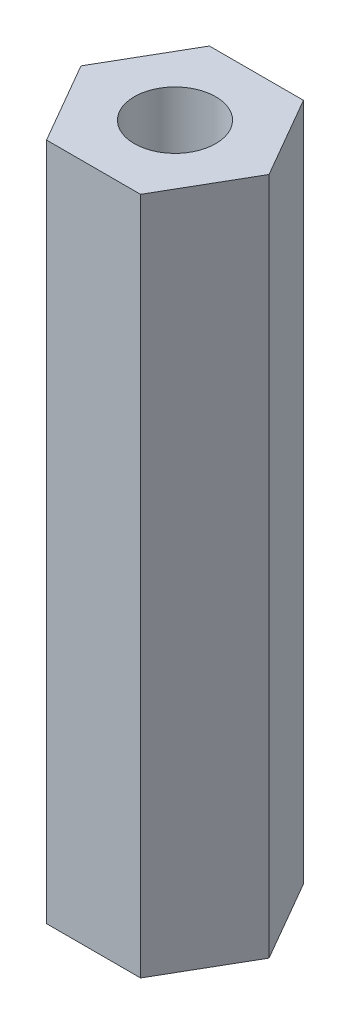
ISO-10303-21;
HEADER;
FILE_DESCRIPTION(('STEP AP214'),'2;1');
FILE_NAME('part.step','',(''),(''),'','','');
FILE_SCHEMA(('AUTOMOTIVE_DESIGN { 1 0 10303 214 1 1 1 1 }'));
ENDSEC;
DATA;
#1=APPLICATION_CONTEXT('core data for automotive mechanical design processes');
#2=APPLICATION_PROTOCOL_DEFINITION('international standard','automotive_design',2000,#1);
#3=PRODUCT_CONTEXT('',#1,'mechanical');
#4=PRODUCT('Part','Part','',(#3));
#5=PRODUCT_RELATED_PRODUCT_CATEGORY('part','',(#4));
#6=PRODUCT_DEFINITION_FORMATION('','',#4);
#7=PRODUCT_DEFINITION_CONTEXT('part definition',#1,'design');
#8=PRODUCT_DEFINITION('design','',#6,#7);
#9=PRODUCT_DEFINITION_SHAPE('','',#8);
#10=(LENGTH_UNIT() NAMED_UNIT(*) SI_UNIT(.MILLI.,.METRE.));
#11=(NAMED_UNIT(*) PLANE_ANGLE_UNIT() SI_UNIT($,.RADIAN.));
#12=(NAMED_UNIT(*) SI_UNIT($,.STERADIAN.) SOLID_ANGLE_UNIT());
#13=UNCERTAINTY_MEASURE_WITH_UNIT(LENGTH_MEASURE(1.E-05),#10,'distance_accuracy_value','');
#14=(GEOMETRIC_REPRESENTATION_CONTEXT(3) GLOBAL_UNCERTAINTY_ASSIGNED_CONTEXT((#13)) GLOBAL_UNIT_ASSIGNED_CONTEXT((#10,
#11,#12)) REPRESENTATION_CONTEXT('',''));
#15=CARTESIAN_POINT('',(0.,0.,0.));
#16=DIRECTION('',(0.,0.,1.));
#17=DIRECTION('',(1.,0.,0.));
#18=AXIS2_PLACEMENT_3D('',#15,#16,#17);
#19=CARTESIAN_POINT('',(0.,25.,0.));
#20=DIRECTION('',(0.,1.,0.));
#21=DIRECTION('',(0.,0.,1.));
#22=AXIS2_PLACEMENT_3D('',#19,#20,#21);
#23=PLANE('',#22);
#24=DIRECTION('',(-1.,0.,0.));
#25=VECTOR('',#24,1.);
#26=CARTESIAN_POINT('',(1.73205080756888,25.,-3.));
#27=LINE('',#26,#25);
#28=CARTESIAN_POINT('',(1.73205080756888,25.,-3.));
#29=VERTEX_POINT('',#28);
#30=CARTESIAN_POINT('',(-1.73205080756888,25.,-3.));
#31=VERTEX_POINT('',#30);
#32=EDGE_CURVE('E128',#29,#31,#27,.T.);
#33=ORIENTED_EDGE('',*,*,#32,.T.);
#34=DIRECTION('',(-0.5,0.,0.866025403784439));
#35=VECTOR('',#34,1.);
#36=CARTESIAN_POINT('',(-1.73205080756888,25.,-3.));
#37=LINE('',#36,#35);
#38=CARTESIAN_POINT('',(-3.46410161513775,25.,0.));
#39=VERTEX_POINT('',#38);
#40=EDGE_CURVE('E86',#31,#39,#37,.T.);
#41=ORIENTED_EDGE('',*,*,#40,.T.);
#42=DIRECTION('',(0.5,0.,0.866025403784439));
#43=VECTOR('',#42,1.);
#44=CARTESIAN_POINT('',(-3.46410161513775,25.,0.));
#45=LINE('',#44,#43);
#46=CARTESIAN_POINT('',(-1.73205080756888,25.,3.));
#47=VERTEX_POINT('',#46);
#48=EDGE_CURVE('E99',#39,#47,#45,.T.);
#49=ORIENTED_EDGE('',*,*,#48,.T.);
#50=DIRECTION('',(1.,0.,0.));
#51=VECTOR('',#50,1.);
#52=CARTESIAN_POINT('',(-1.73205080756888,25.,3.));
#53=LINE('',#52,#51);
#54=CARTESIAN_POINT('',(1.73205080756888,25.,3.));
#55=VERTEX_POINT('',#54);
#56=EDGE_CURVE('E93',#47,#55,#53,.T.);
#57=ORIENTED_EDGE('',*,*,#56,.T.);
#58=DIRECTION('',(0.5,0.,-0.866025403784438));
#59=VECTOR('',#58,1.);
#60=CARTESIAN_POINT('',(1.73205080756888,25.,3.));
#61=LINE('',#60,#59);
#62=CARTESIAN_POINT('',(3.46410161513776,25.,0.));
#63=VERTEX_POINT('',#62);
#64=EDGE_CURVE('E97',#55,#63,#61,.T.);
#65=ORIENTED_EDGE('',*,*,#64,.T.);
#66=DIRECTION('',(-0.5,0.,-0.866025403784439));
#67=VECTOR('',#66,1.);
#68=CARTESIAN_POINT('',(3.46410161513776,25.,0.));
#69=LINE('',#68,#67);
#70=EDGE_CURVE('E49',#63,#29,#69,.T.);
#71=ORIENTED_EDGE('',*,*,#70,.T.);
#72=EDGE_LOOP('',(#33,#41,#49,#57,#65,#71));
#73=FACE_BOUND('',#72,.T.);
#74=CARTESIAN_POINT('',(0.,25.,0.));
#75=DIRECTION('',(0.,1.,0.));
#76=DIRECTION('',(0.,0.,1.));
#77=AXIS2_PLACEMENT_3D('',#74,#75,#76);
#78=CIRCLE('',#77,1.5);
#79=CARTESIAN_POINT('',(0.,25.,1.5));
#80=VERTEX_POINT('',#79);
#81=EDGE_CURVE('E121',#80,#80,#78,.T.);
#82=ORIENTED_EDGE('',*,*,#81,.F.);
#83=EDGE_LOOP('',(#82));
#84=FACE_BOUND('',#83,.T.);
#85=ADVANCED_FACE('F32',(#73,#84),#23,.T.);
#86=CARTESIAN_POINT('',(0.,0.,0.));
#87=DIRECTION('',(0.,1.,0.));
#88=DIRECTION('',(0.,0.,1.));
#89=AXIS2_PLACEMENT_3D('',#86,#87,#88);
#90=PLANE('',#89);
#91=DIRECTION('',(-1.,0.,0.));
#92=VECTOR('',#91,1.);
#93=CARTESIAN_POINT('',(1.73205080756888,0.,-3.));
#94=LINE('',#93,#92);
#95=CARTESIAN_POINT('',(1.73205080756888,0.,-3.));
#96=VERTEX_POINT('',#95);
#97=CARTESIAN_POINT('',(-1.73205080756888,0.,-3.));
#98=VERTEX_POINT('',#97);
#99=EDGE_CURVE('E117',#96,#98,#94,.T.);
#100=ORIENTED_EDGE('',*,*,#99,.F.);
#101=DIRECTION('',(-0.5,0.,-0.866025403784439));
#102=VECTOR('',#101,1.);
#103=CARTESIAN_POINT('',(3.46410161513776,0.,0.));
#104=LINE('',#103,#102);
#105=CARTESIAN_POINT('',(3.46410161513776,0.,0.));
#106=VERTEX_POINT('',#105);
#107=EDGE_CURVE('E78',#106,#96,#104,.T.);
#108=ORIENTED_EDGE('',*,*,#107,.F.);
#109=DIRECTION('',(0.5,0.,-0.866025403784438));
#110=VECTOR('',#109,1.);
#111=CARTESIAN_POINT('',(1.73205080756888,0.,3.));
#112=LINE('',#111,#110);
#113=CARTESIAN_POINT('',(1.73205080756888,0.,3.));
#114=VERTEX_POINT('',#113);
#115=EDGE_CURVE('E72',#114,#106,#112,.T.);
#116=ORIENTED_EDGE('',*,*,#115,.F.);
#117=DIRECTION('',(1.,0.,0.));
#118=VECTOR('',#117,1.);
#119=CARTESIAN_POINT('',(-1.73205080756888,0.,3.));
#120=LINE('',#119,#118);
#121=CARTESIAN_POINT('',(-1.73205080756888,0.,3.));
#122=VERTEX_POINT('',#121);
#123=EDGE_CURVE('E107',#122,#114,#120,.T.);
#124=ORIENTED_EDGE('',*,*,#123,.F.);
#125=DIRECTION('',(0.5,0.,0.866025403784439));
#126=VECTOR('',#125,1.);
#127=CARTESIAN_POINT('',(-3.46410161513775,0.,0.));
#128=LINE('',#127,#126);
#129=CARTESIAN_POINT('',(-3.46410161513775,0.,0.));
#130=VERTEX_POINT('',#129);
#131=EDGE_CURVE('E123',#130,#122,#128,.T.);
#132=ORIENTED_EDGE('',*,*,#131,.F.);
#133=DIRECTION('',(-0.5,0.,0.866025403784439));
#134=VECTOR('',#133,1.);
#135=CARTESIAN_POINT('',(-1.73205080756888,0.,-3.));
#136=LINE('',#135,#134);
#137=EDGE_CURVE('E120',#98,#130,#136,.T.);
#138=ORIENTED_EDGE('',*,*,#137,.F.);
#139=EDGE_LOOP('',(#100,#108,#116,#124,#132,#138));
#140=FACE_BOUND('',#139,.T.);
#141=CARTESIAN_POINT('',(0.,0.,0.));
#142=DIRECTION('',(0.,1.,0.));
#143=DIRECTION('',(0.,0.,1.));
#144=AXIS2_PLACEMENT_3D('',#141,#142,#143);
#145=CIRCLE('',#144,1.5);
#146=CARTESIAN_POINT('',(0.,0.,1.5));
#147=VERTEX_POINT('',#146);
#148=EDGE_CURVE('E221',#147,#147,#145,.T.);
#149=ORIENTED_EDGE('',*,*,#148,.T.);
#150=EDGE_LOOP('',(#149));
#151=FACE_BOUND('',#150,.T.);
#152=ADVANCED_FACE('F137',(#140,#151),#90,.F.);
#153=CARTESIAN_POINT('',(1.73205080756888,25.,-3.));
#154=DIRECTION('',(0.,0.,1.));
#155=DIRECTION('',(1.,0.,0.));
#156=AXIS2_PLACEMENT_3D('',#153,#154,#155);
#157=PLANE('',#156);
#158=ORIENTED_EDGE('',*,*,#99,.T.);
#159=DIRECTION('',(0.,-1.,0.));
#160=VECTOR('',#159,1.);
#161=CARTESIAN_POINT('',(-1.73205080756888,25.,-3.));
#162=LINE('',#161,#160);
#163=EDGE_CURVE('E11',#31,#98,#162,.T.);
#164=ORIENTED_EDGE('',*,*,#163,.F.);
#165=ORIENTED_EDGE('',*,*,#32,.F.);
#166=DIRECTION('',(0.,-1.,0.));
#167=VECTOR('',#166,1.);
#168=CARTESIAN_POINT('',(1.73205080756888,25.,-3.));
#169=LINE('',#168,#167);
#170=EDGE_CURVE('E113',#29,#96,#169,.T.);
#171=ORIENTED_EDGE('',*,*,#170,.T.);
#172=EDGE_LOOP('',(#158,#164,#165,#171));
#173=FACE_BOUND('',#172,.T.);
#174=ADVANCED_FACE('F34',(#173),#157,.F.);
#175=CARTESIAN_POINT('',(-1.73205080756888,25.,-3.));
#176=DIRECTION('',(0.866025403784439,0.,0.5));
#177=DIRECTION('',(0.5,0.,-0.866025403784439));
#178=AXIS2_PLACEMENT_3D('',#175,#176,#177);
#179=PLANE('',#178);
#180=ORIENTED_EDGE('',*,*,#137,.T.);
#181=DIRECTION('',(0.,-1.,0.));
#182=VECTOR('',#181,1.);
#183=CARTESIAN_POINT('',(-3.46410161513775,25.,0.));
#184=LINE('',#183,#182);
#185=EDGE_CURVE('E41',#39,#130,#184,.T.);
#186=ORIENTED_EDGE('',*,*,#185,.F.);
#187=ORIENTED_EDGE('',*,*,#40,.F.);
#188=ORIENTED_EDGE('',*,*,#163,.T.);
#189=EDGE_LOOP('',(#180,#186,#187,#188));
#190=FACE_BOUND('',#189,.T.);
#191=ADVANCED_FACE('F162',(#190),#179,.F.);
#192=CARTESIAN_POINT('',(-3.46410161513775,25.,0.));
#193=DIRECTION('',(0.866025403784439,0.,-0.5));
#194=DIRECTION('',(-0.5,0.,-0.866025403784439));
#195=AXIS2_PLACEMENT_3D('',#192,#193,#194);
#196=PLANE('',#195);
#197=ORIENTED_EDGE('',*,*,#131,.T.);
#198=DIRECTION('',(0.,-1.,0.));
#199=VECTOR('',#198,1.);
#200=CARTESIAN_POINT('',(-1.73205080756888,25.,3.));
#201=LINE('',#200,#199);
#202=EDGE_CURVE('E108',#47,#122,#201,.T.);
#203=ORIENTED_EDGE('',*,*,#202,.F.);
#204=ORIENTED_EDGE('',*,*,#48,.F.);
#205=ORIENTED_EDGE('',*,*,#185,.T.);
#206=EDGE_LOOP('',(#197,#203,#204,#205));
#207=FACE_BOUND('',#206,.T.);
#208=ADVANCED_FACE('F134',(#207),#196,.F.);
#209=CARTESIAN_POINT('',(-1.73205080756888,25.,3.));
#210=DIRECTION('',(0.,0.,-1.));
#211=DIRECTION('',(-1.,0.,0.));
#212=AXIS2_PLACEMENT_3D('',#209,#210,#211);
#213=PLANE('',#212);
#214=ORIENTED_EDGE('',*,*,#123,.T.);
#215=DIRECTION('',(0.,-1.,0.));
#216=VECTOR('',#215,1.);
#217=CARTESIAN_POINT('',(1.73205080756888,25.,3.));
#218=LINE('',#217,#216);
#219=EDGE_CURVE('E104',#55,#114,#218,.T.);
#220=ORIENTED_EDGE('',*,*,#219,.F.);
#221=ORIENTED_EDGE('',*,*,#56,.F.);
#222=ORIENTED_EDGE('',*,*,#202,.T.);
#223=EDGE_LOOP('',(#214,#220,#221,#222));
#224=FACE_BOUND('',#223,.T.);
#225=ADVANCED_FACE('F105',(#224),#213,.F.);
#226=CARTESIAN_POINT('',(1.73205080756888,25.,3.));
#227=DIRECTION('',(-0.866025403784438,0.,-0.5));
#228=DIRECTION('',(-0.5,0.,0.866025403784438));
#229=AXIS2_PLACEMENT_3D('',#226,#227,#228);
#230=PLANE('',#229);
#231=ORIENTED_EDGE('',*,*,#115,.T.);
#232=DIRECTION('',(0.,-1.,0.));
#233=VECTOR('',#232,1.);
#234=CARTESIAN_POINT('',(3.46410161513776,25.,0.));
#235=LINE('',#234,#233);
#236=EDGE_CURVE('E109',#63,#106,#235,.T.);
#237=ORIENTED_EDGE('',*,*,#236,.F.);
#238=ORIENTED_EDGE('',*,*,#64,.F.);
#239=ORIENTED_EDGE('',*,*,#219,.T.);
#240=EDGE_LOOP('',(#231,#237,#238,#239));
#241=FACE_BOUND('',#240,.T.);
#242=ADVANCED_FACE('F111',(#241),#230,.F.);
#243=CARTESIAN_POINT('',(3.46410161513776,25.,0.));
#244=DIRECTION('',(-0.866025403784438,0.,0.5));
#245=DIRECTION('',(0.5,0.,0.866025403784438));
#246=AXIS2_PLACEMENT_3D('',#243,#244,#245);
#247=PLANE('',#246);
#248=ORIENTED_EDGE('',*,*,#107,.T.);
#249=ORIENTED_EDGE('',*,*,#170,.F.);
#250=ORIENTED_EDGE('',*,*,#70,.F.);
#251=ORIENTED_EDGE('',*,*,#236,.T.);
#252=EDGE_LOOP('',(#248,#249,#250,#251));
#253=FACE_BOUND('',#252,.T.);
#254=ADVANCED_FACE('F142',(#253),#247,.F.);
#255=CARTESIAN_POINT('',(0.,25.,0.));
#256=DIRECTION('',(0.,-1.,0.));
#257=DIRECTION('',(0.,0.,-1.));
#258=AXIS2_PLACEMENT_3D('',#255,#256,#257);
#259=CYLINDRICAL_SURFACE('',#258,1.5);
#260=ORIENTED_EDGE('',*,*,#81,.T.);
#261=EDGE_LOOP('',(#260));
#262=FACE_BOUND('',#261,.T.);
#263=ORIENTED_EDGE('',*,*,#148,.F.);
#264=EDGE_LOOP('',(#263));
#265=FACE_BOUND('',#264,.T.);
#266=ADVANCED_FACE('F144',(#262,#265),#259,.F.);
#267=CLOSED_SHELL('',(#85,#152,#174,#191,#208,#225,#242,#254,#266));
#268=MANIFOLD_SOLID_BREP('B2',#267);
#269=ADVANCED_BREP_SHAPE_REPRESENTATION('',(#18,#268),#14);
#270=SHAPE_DEFINITION_REPRESENTATION(#9,#269);
ENDSEC;
END-ISO-10303-21;
